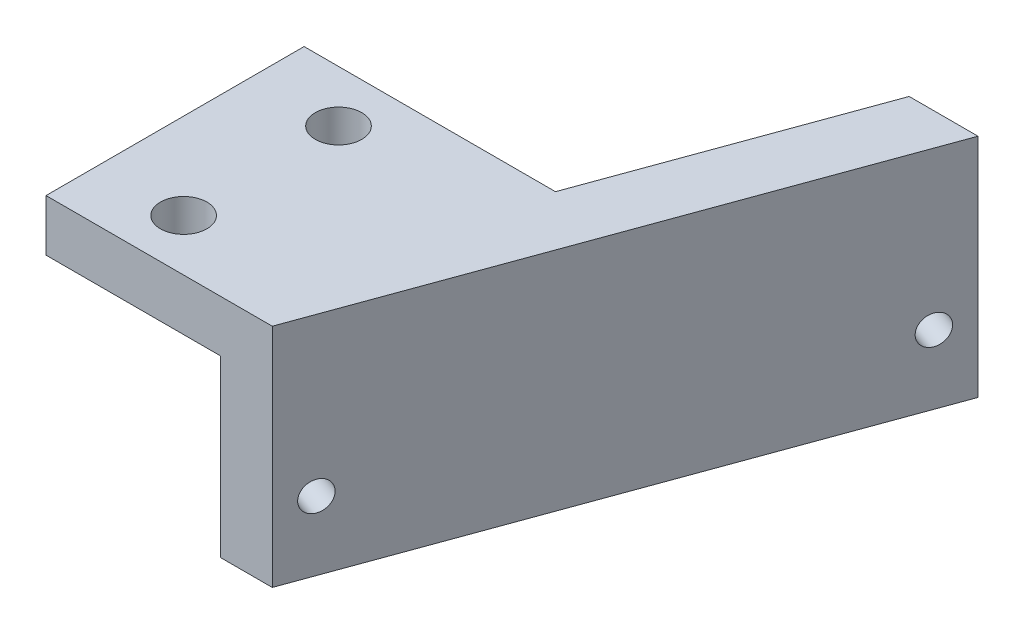
ISO-10303-21;
HEADER;
FILE_DESCRIPTION(('STEP AP214'),'2;1');
FILE_NAME('part.step','',(''),(''),'','','');
FILE_SCHEMA(('AUTOMOTIVE_DESIGN { 1 0 10303 214 1 1 1 1 }'));
ENDSEC;
DATA;
#1=APPLICATION_CONTEXT('core data for automotive mechanical design processes');
#2=APPLICATION_PROTOCOL_DEFINITION('international standard','automotive_design',2000,#1);
#3=PRODUCT_CONTEXT('',#1,'mechanical');
#4=PRODUCT('Part','Part','',(#3));
#5=PRODUCT_RELATED_PRODUCT_CATEGORY('part','',(#4));
#6=PRODUCT_DEFINITION_FORMATION('','',#4);
#7=PRODUCT_DEFINITION_CONTEXT('part definition',#1,'design');
#8=PRODUCT_DEFINITION('design','',#6,#7);
#9=PRODUCT_DEFINITION_SHAPE('','',#8);
#10=(LENGTH_UNIT() NAMED_UNIT(*) SI_UNIT(.MILLI.,.METRE.));
#11=(NAMED_UNIT(*) PLANE_ANGLE_UNIT() SI_UNIT($,.RADIAN.));
#12=(NAMED_UNIT(*) SI_UNIT($,.STERADIAN.) SOLID_ANGLE_UNIT());
#13=UNCERTAINTY_MEASURE_WITH_UNIT(LENGTH_MEASURE(1.E-05),#10,'distance_accuracy_value','');
#14=(GEOMETRIC_REPRESENTATION_CONTEXT(3) GLOBAL_UNCERTAINTY_ASSIGNED_CONTEXT((#13)) GLOBAL_UNIT_ASSIGNED_CONTEXT((#10,
#11,#12)) REPRESENTATION_CONTEXT('',''));
#15=CARTESIAN_POINT('',(0.,0.,0.));
#16=DIRECTION('',(0.,0.,1.));
#17=DIRECTION('',(1.,0.,0.));
#18=AXIS2_PLACEMENT_3D('',#15,#16,#17);
#19=CARTESIAN_POINT('',(6.,0.,30.));
#20=DIRECTION('',(0.,1.,0.));
#21=DIRECTION('',(-1.,0.,0.));
#22=AXIS2_PLACEMENT_3D('',#19,#20,#21);
#23=PLANE('',#22);
#24=DIRECTION('',(1.,0.,0.));
#25=VECTOR('',#24,1.);
#26=CARTESIAN_POINT('',(6.,0.,0.));
#27=LINE('',#26,#25);
#28=CARTESIAN_POINT('',(0.,0.,0.));
#29=VERTEX_POINT('',#28);
#30=CARTESIAN_POINT('',(8.91910702798621,0.,0.));
#31=VERTEX_POINT('',#30);
#32=EDGE_CURVE('E158',#29,#31,#27,.T.);
#33=ORIENTED_EDGE('',*,*,#32,.T.);
#34=DIRECTION('',(0.342020143325672,0.,-0.939692620785907));
#35=VECTOR('',#34,1.);
#36=CARTESIAN_POINT('',(19.889289172843,0.,-30.1403277302981));
#37=LINE('',#36,#35);
#38=CARTESIAN_POINT('',(19.889289172843,0.,-30.1403277302981));
#39=VERTEX_POINT('',#38);
#40=EDGE_CURVE('E163',#31,#39,#37,.T.);
#41=ORIENTED_EDGE('',*,*,#40,.T.);
#42=DIRECTION('',(1.,0.,0.));
#43=VECTOR('',#42,1.);
#44=CARTESIAN_POINT('',(27.889289172843,0.,-30.1403277302981));
#45=LINE('',#44,#43);
#46=CARTESIAN_POINT('',(27.889289172843,0.,-30.1403277302981));
#47=VERTEX_POINT('',#46);
#48=EDGE_CURVE('E139',#39,#47,#45,.T.);
#49=ORIENTED_EDGE('',*,*,#48,.T.);
#50=DIRECTION('',(-0.342020143325673,0.,0.939692620785907));
#51=VECTOR('',#50,1.);
#52=CARTESIAN_POINT('',(16.9191070279862,0.,0.));
#53=LINE('',#52,#51);
#54=CARTESIAN_POINT('',(6.,0.,30.));
#55=VERTEX_POINT('',#54);
#56=EDGE_CURVE('E159',#47,#55,#53,.T.);
#57=ORIENTED_EDGE('',*,*,#56,.T.);
#58=DIRECTION('',(1.,0.,0.));
#59=VECTOR('',#58,1.);
#60=CARTESIAN_POINT('',(6.,0.,30.));
#61=LINE('',#60,#59);
#62=CARTESIAN_POINT('',(0.,0.,30.));
#63=VERTEX_POINT('',#62);
#64=EDGE_CURVE('E164',#63,#55,#61,.T.);
#65=ORIENTED_EDGE('',*,*,#64,.F.);
#66=DIRECTION('',(0.,0.,-1.));
#67=VECTOR('',#66,1.);
#68=CARTESIAN_POINT('',(0.,0.,30.));
#69=LINE('',#68,#67);
#70=EDGE_CURVE('E183',#63,#29,#69,.T.);
#71=ORIENTED_EDGE('',*,*,#70,.T.);
#72=EDGE_LOOP('',(#33,#41,#49,#57,#65,#71));
#73=FACE_BOUND('',#72,.T.);
#74=ADVANCED_FACE('F39',(#73),#23,.F.);
#75=CARTESIAN_POINT('',(-20.3,26.3,30.));
#76=DIRECTION('',(0.,-1.,0.));
#77=DIRECTION('',(1.,0.,0.));
#78=AXIS2_PLACEMENT_3D('',#75,#76,#77);
#79=PLANE('',#78);
#80=CARTESIAN_POINT('',(-10.3,26.3,24.));
#81=DIRECTION('',(0.,1.,0.));
#82=DIRECTION('',(-1.,0.,0.));
#83=AXIS2_PLACEMENT_3D('',#80,#81,#82);
#84=CIRCLE('',#83,2.7);
#85=CARTESIAN_POINT('',(-13.,26.3,24.));
#86=VERTEX_POINT('',#85);
#87=EDGE_CURVE('E227',#86,#86,#84,.T.);
#88=ORIENTED_EDGE('',*,*,#87,.F.);
#89=EDGE_LOOP('',(#88));
#90=FACE_BOUND('',#89,.T.);
#91=CARTESIAN_POINT('',(-10.3,26.3,6.));
#92=DIRECTION('',(0.,1.,0.));
#93=DIRECTION('',(-1.,0.,0.));
#94=AXIS2_PLACEMENT_3D('',#91,#92,#93);
#95=CIRCLE('',#94,2.7);
#96=CARTESIAN_POINT('',(-13.,26.3,6.));
#97=VERTEX_POINT('',#96);
#98=EDGE_CURVE('E234',#97,#97,#95,.T.);
#99=ORIENTED_EDGE('',*,*,#98,.F.);
#100=EDGE_LOOP('',(#99));
#101=FACE_BOUND('',#100,.T.);
#102=DIRECTION('',(0.342020143325673,0.,-0.939692620785907));
#103=VECTOR('',#102,1.);
#104=CARTESIAN_POINT('',(16.9191070279862,26.3,0.));
#105=LINE('',#104,#103);
#106=CARTESIAN_POINT('',(6.,26.3,30.));
#107=VERTEX_POINT('',#106);
#108=CARTESIAN_POINT('',(27.889289172843,26.3,-30.1403277302981));
#109=VERTEX_POINT('',#108);
#110=EDGE_CURVE('E155',#107,#109,#105,.T.);
#111=ORIENTED_EDGE('',*,*,#110,.T.);
#112=DIRECTION('',(-1.,0.,0.));
#113=VECTOR('',#112,1.);
#114=CARTESIAN_POINT('',(27.889289172843,26.3,-30.1403277302981));
#115=LINE('',#114,#113);
#116=CARTESIAN_POINT('',(19.889289172843,26.3,-30.1403277302981));
#117=VERTEX_POINT('',#116);
#118=EDGE_CURVE('E251',#109,#117,#115,.T.);
#119=ORIENTED_EDGE('',*,*,#118,.T.);
#120=DIRECTION('',(-0.342020143325673,0.,0.939692620785907));
#121=VECTOR('',#120,1.);
#122=CARTESIAN_POINT('',(19.889289172843,26.3,-30.1403277302981));
#123=LINE('',#122,#121);
#124=CARTESIAN_POINT('',(8.91910702798621,26.3,0.));
#125=VERTEX_POINT('',#124);
#126=EDGE_CURVE('E154',#117,#125,#123,.T.);
#127=ORIENTED_EDGE('',*,*,#126,.T.);
#128=DIRECTION('',(-1.,0.,0.));
#129=VECTOR('',#128,1.);
#130=CARTESIAN_POINT('',(-20.3,26.3,0.));
#131=LINE('',#130,#129);
#132=CARTESIAN_POINT('',(-20.3,26.3,0.));
#133=VERTEX_POINT('',#132);
#134=EDGE_CURVE('E186',#125,#133,#131,.T.);
#135=ORIENTED_EDGE('',*,*,#134,.T.);
#136=DIRECTION('',(0.,0.,-1.));
#137=VECTOR('',#136,1.);
#138=CARTESIAN_POINT('',(-20.3,26.3,30.));
#139=LINE('',#138,#137);
#140=CARTESIAN_POINT('',(-20.3,26.3,30.));
#141=VERTEX_POINT('',#140);
#142=EDGE_CURVE('E208',#141,#133,#139,.T.);
#143=ORIENTED_EDGE('',*,*,#142,.F.);
#144=DIRECTION('',(-1.,0.,0.));
#145=VECTOR('',#144,1.);
#146=CARTESIAN_POINT('',(-20.3,26.3,30.));
#147=LINE('',#146,#145);
#148=EDGE_CURVE('E171',#107,#141,#147,.T.);
#149=ORIENTED_EDGE('',*,*,#148,.F.);
#150=EDGE_LOOP('',(#111,#119,#127,#135,#143,#149));
#151=FACE_BOUND('',#150,.T.);
#152=ADVANCED_FACE('F265',(#90,#101,#151),#79,.F.);
#153=CARTESIAN_POINT('',(-20.3,20.3,30.));
#154=DIRECTION('',(1.,0.,0.));
#155=DIRECTION('',(0.,1.,0.));
#156=AXIS2_PLACEMENT_3D('',#153,#154,#155);
#157=PLANE('',#156);
#158=DIRECTION('',(0.,-1.,0.));
#159=VECTOR('',#158,1.);
#160=CARTESIAN_POINT('',(-20.3,20.3,0.));
#161=LINE('',#160,#159);
#162=CARTESIAN_POINT('',(-20.3,20.3,0.));
#163=VERTEX_POINT('',#162);
#164=EDGE_CURVE('E189',#133,#163,#161,.T.);
#165=ORIENTED_EDGE('',*,*,#164,.T.);
#166=DIRECTION('',(0.,0.,-1.));
#167=VECTOR('',#166,1.);
#168=CARTESIAN_POINT('',(-20.3,20.3,30.));
#169=LINE('',#168,#167);
#170=CARTESIAN_POINT('',(-20.3,20.3,30.));
#171=VERTEX_POINT('',#170);
#172=EDGE_CURVE('E204',#171,#163,#169,.T.);
#173=ORIENTED_EDGE('',*,*,#172,.F.);
#174=DIRECTION('',(0.,-1.,0.));
#175=VECTOR('',#174,1.);
#176=CARTESIAN_POINT('',(-20.3,20.3,30.));
#177=LINE('',#176,#175);
#178=EDGE_CURVE('E174',#141,#171,#177,.T.);
#179=ORIENTED_EDGE('',*,*,#178,.F.);
#180=ORIENTED_EDGE('',*,*,#142,.T.);
#181=EDGE_LOOP('',(#165,#173,#179,#180));
#182=FACE_BOUND('',#181,.T.);
#183=ADVANCED_FACE('F287',(#182),#157,.F.);
#184=CARTESIAN_POINT('',(0.,20.3,30.));
#185=DIRECTION('',(0.,1.,0.));
#186=DIRECTION('',(-1.,0.,0.));
#187=AXIS2_PLACEMENT_3D('',#184,#185,#186);
#188=PLANE('',#187);
#189=CARTESIAN_POINT('',(-10.3,20.3,24.));
#190=DIRECTION('',(0.,1.,0.));
#191=DIRECTION('',(-1.,0.,0.));
#192=AXIS2_PLACEMENT_3D('',#189,#190,#191);
#193=CIRCLE('',#192,2.7);
#194=CARTESIAN_POINT('',(-13.,20.3,24.));
#195=VERTEX_POINT('',#194);
#196=EDGE_CURVE('E42',#195,#195,#193,.T.);
#197=ORIENTED_EDGE('',*,*,#196,.T.);
#198=EDGE_LOOP('',(#197));
#199=FACE_BOUND('',#198,.T.);
#200=CARTESIAN_POINT('',(-10.3,20.3,6.));
#201=DIRECTION('',(0.,1.,0.));
#202=DIRECTION('',(-1.,0.,0.));
#203=AXIS2_PLACEMENT_3D('',#200,#201,#202);
#204=CIRCLE('',#203,2.7);
#205=CARTESIAN_POINT('',(-13.,20.3,6.));
#206=VERTEX_POINT('',#205);
#207=EDGE_CURVE('E224',#206,#206,#204,.T.);
#208=ORIENTED_EDGE('',*,*,#207,.T.);
#209=EDGE_LOOP('',(#208));
#210=FACE_BOUND('',#209,.T.);
#211=DIRECTION('',(1.,0.,0.));
#212=VECTOR('',#211,1.);
#213=CARTESIAN_POINT('',(0.,20.3,0.));
#214=LINE('',#213,#212);
#215=CARTESIAN_POINT('',(0.,20.3,0.));
#216=VERTEX_POINT('',#215);
#217=EDGE_CURVE('E192',#163,#216,#214,.T.);
#218=ORIENTED_EDGE('',*,*,#217,.T.);
#219=DIRECTION('',(0.,0.,-1.));
#220=VECTOR('',#219,1.);
#221=CARTESIAN_POINT('',(0.,20.3,30.));
#222=LINE('',#221,#220);
#223=CARTESIAN_POINT('',(0.,20.3,30.));
#224=VERTEX_POINT('',#223);
#225=EDGE_CURVE('E200',#224,#216,#222,.T.);
#226=ORIENTED_EDGE('',*,*,#225,.F.);
#227=DIRECTION('',(1.,0.,0.));
#228=VECTOR('',#227,1.);
#229=CARTESIAN_POINT('',(0.,20.3,30.));
#230=LINE('',#229,#228);
#231=EDGE_CURVE('E177',#171,#224,#230,.T.);
#232=ORIENTED_EDGE('',*,*,#231,.F.);
#233=ORIENTED_EDGE('',*,*,#172,.T.);
#234=EDGE_LOOP('',(#218,#226,#232,#233));
#235=FACE_BOUND('',#234,.T.);
#236=ADVANCED_FACE('F283',(#199,#210,#235),#188,.F.);
#237=CARTESIAN_POINT('',(0.,0.,30.));
#238=DIRECTION('',(1.,0.,0.));
#239=DIRECTION('',(0.,0.,-1.));
#240=AXIS2_PLACEMENT_3D('',#237,#238,#239);
#241=PLANE('',#240);
#242=CARTESIAN_POINT('',(0.,7.99999999999998,23.5594675044991));
#243=DIRECTION('',(1.,0.,0.));
#244=DIRECTION('',(0.,0.,1.));
#245=AXIS2_PLACEMENT_3D('',#242,#243,#244);
#246=ELLIPSE('',#245,3.13932442880395,2.95);
#247=CARTESIAN_POINT('',(0.,7.99999999999998,26.6987919333031));
#248=VERTEX_POINT('',#247);
#249=EDGE_CURVE('E220',#248,#248,#246,.T.);
#250=ORIENTED_EDGE('',*,*,#249,.T.);
#251=EDGE_LOOP('',(#250));
#252=FACE_BOUND('',#251,.T.);
#253=DIRECTION('',(0.,-1.,0.));
#254=VECTOR('',#253,1.);
#255=CARTESIAN_POINT('',(0.,0.,0.));
#256=LINE('',#255,#254);
#257=EDGE_CURVE('E168',#216,#29,#256,.T.);
#258=ORIENTED_EDGE('',*,*,#257,.T.);
#259=ORIENTED_EDGE('',*,*,#70,.F.);
#260=DIRECTION('',(0.,-1.,0.));
#261=VECTOR('',#260,1.);
#262=CARTESIAN_POINT('',(0.,0.,30.));
#263=LINE('',#262,#261);
#264=EDGE_CURVE('E180',#224,#63,#263,.T.);
#265=ORIENTED_EDGE('',*,*,#264,.F.);
#266=ORIENTED_EDGE('',*,*,#225,.T.);
#267=EDGE_LOOP('',(#258,#259,#265,#266));
#268=FACE_BOUND('',#267,.T.);
#269=ADVANCED_FACE('F278',(#252,#268),#241,.F.);
#270=CARTESIAN_POINT('',(0.,0.,30.));
#271=DIRECTION('',(0.,0.,-1.));
#272=DIRECTION('',(-1.,0.,0.));
#273=AXIS2_PLACEMENT_3D('',#270,#271,#272);
#274=PLANE('',#273);
#275=ORIENTED_EDGE('',*,*,#64,.T.);
#276=DIRECTION('',(0.,1.,0.));
#277=VECTOR('',#276,1.);
#278=CARTESIAN_POINT('',(6.,26.3,30.));
#279=LINE('',#278,#277);
#280=EDGE_CURVE('E167',#55,#107,#279,.T.);
#281=ORIENTED_EDGE('',*,*,#280,.T.);
#282=ORIENTED_EDGE('',*,*,#148,.T.);
#283=ORIENTED_EDGE('',*,*,#178,.T.);
#284=ORIENTED_EDGE('',*,*,#231,.T.);
#285=ORIENTED_EDGE('',*,*,#264,.T.);
#286=EDGE_LOOP('',(#275,#281,#282,#283,#284,#285));
#287=FACE_BOUND('',#286,.T.);
#288=ADVANCED_FACE('F294',(#287),#274,.F.);
#289=CARTESIAN_POINT('',(0.,0.,0.));
#290=DIRECTION('',(0.,0.,-1.));
#291=DIRECTION('',(-1.,0.,0.));
#292=AXIS2_PLACEMENT_3D('',#289,#290,#291);
#293=PLANE('',#292);
#294=DIRECTION('',(0.,1.,0.));
#295=VECTOR('',#294,1.);
#296=CARTESIAN_POINT('',(8.9191070279862,-35.613300412891,0.));
#297=LINE('',#296,#295);
#298=EDGE_CURVE('E63',#31,#125,#297,.T.);
#299=ORIENTED_EDGE('',*,*,#298,.F.);
#300=ORIENTED_EDGE('',*,*,#32,.F.);
#301=ORIENTED_EDGE('',*,*,#257,.F.);
#302=ORIENTED_EDGE('',*,*,#217,.F.);
#303=ORIENTED_EDGE('',*,*,#164,.F.);
#304=ORIENTED_EDGE('',*,*,#134,.F.);
#305=EDGE_LOOP('',(#299,#300,#301,#302,#303,#304));
#306=FACE_BOUND('',#305,.T.);
#307=ADVANCED_FACE('F274',(#306),#293,.T.);
#308=CARTESIAN_POINT('',(16.9191070279862,58.2253331742774,0.));
#309=DIRECTION('',(0.939692620785907,0.,0.342020143325673));
#310=DIRECTION('',(0.342020143325673,0.,-0.939692620785907));
#311=AXIS2_PLACEMENT_3D('',#308,#309,#310);
#312=PLANE('',#311);
#313=CARTESIAN_POINT('',(7.3680805733027,7.99999999999998,26.2412295168564));
#314=DIRECTION('',(0.939692620785907,0.,0.342020143325673));
#315=DIRECTION('',(0.342020143325673,0.,-0.939692620785907));
#316=AXIS2_PLACEMENT_3D('',#313,#314,#315);
#317=CIRCLE('',#316,1.7);
#318=CARTESIAN_POINT('',(7.94951481695634,7.99999999999998,24.6437520615203));
#319=VERTEX_POINT('',#318);
#320=EDGE_CURVE('E247',#319,#319,#317,.T.);
#321=ORIENTED_EDGE('',*,*,#320,.F.);
#322=EDGE_LOOP('',(#321));
#323=FACE_BOUND('',#322,.T.);
#324=CARTESIAN_POINT('',(26.5212085995404,7.99999999999998,-26.3815572471544));
#325=DIRECTION('',(0.939692620785907,0.,0.342020143325673));
#326=DIRECTION('',(-0.342020143325673,0.,0.939692620785907));
#327=AXIS2_PLACEMENT_3D('',#324,#325,#326);
#328=CIRCLE('',#327,1.7);
#329=CARTESIAN_POINT('',(25.9397743558867,7.99999999999998,-24.7840797918184));
#330=VERTEX_POINT('',#329);
#331=EDGE_CURVE('E223',#330,#330,#328,.T.);
#332=ORIENTED_EDGE('',*,*,#331,.F.);
#333=EDGE_LOOP('',(#332));
#334=FACE_BOUND('',#333,.T.);
#335=ORIENTED_EDGE('',*,*,#110,.F.);
#336=ORIENTED_EDGE('',*,*,#280,.F.);
#337=ORIENTED_EDGE('',*,*,#56,.F.);
#338=DIRECTION('',(0.,1.,0.));
#339=VECTOR('',#338,1.);
#340=CARTESIAN_POINT('',(27.889289172843,-35.613300412891,-30.1403277302981));
#341=LINE('',#340,#339);
#342=EDGE_CURVE('E148',#47,#109,#341,.T.);
#343=ORIENTED_EDGE('',*,*,#342,.T.);
#344=EDGE_LOOP('',(#335,#336,#337,#343));
#345=FACE_BOUND('',#344,.T.);
#346=ADVANCED_FACE('F293',(#323,#334,#345),#312,.T.);
#347=CARTESIAN_POINT('',(19.889289172843,-35.613300412891,-30.1403277302981));
#348=DIRECTION('',(-0.939692620785907,0.,-0.342020143325672));
#349=DIRECTION('',(-0.342020143325672,0.,0.939692620785907));
#350=AXIS2_PLACEMENT_3D('',#347,#348,#349);
#351=PLANE('',#350);
#352=CARTESIAN_POINT('',(19.4570308270645,7.99999999999998,-28.9527076859006));
#353=DIRECTION('',(-0.939692620785907,0.,-0.342020143325672));
#354=DIRECTION('',(-0.342020143325672,0.,0.939692620785907));
#355=AXIS2_PLACEMENT_3D('',#352,#353,#354);
#356=CIRCLE('',#355,2.95);
#357=CARTESIAN_POINT('',(19.889289172843,5.33443976758162,-30.1403277302981));
#358=VERTEX_POINT('',#357);
#359=CARTESIAN_POINT('',(19.889289172843,10.6655602324183,-30.1403277302981));
#360=VERTEX_POINT('',#359);
#361=EDGE_CURVE('E123',#358,#360,#356,.T.);
#362=ORIENTED_EDGE('',*,*,#361,.F.);
#363=DIRECTION('',(0.,1.,0.));
#364=VECTOR('',#363,1.);
#365=CARTESIAN_POINT('',(19.889289172843,-35.613300412891,-30.1403277302981));
#366=LINE('',#365,#364);
#367=EDGE_CURVE('E136',#39,#358,#366,.T.);
#368=ORIENTED_EDGE('',*,*,#367,.F.);
#369=ORIENTED_EDGE('',*,*,#40,.F.);
#370=ORIENTED_EDGE('',*,*,#298,.T.);
#371=ORIENTED_EDGE('',*,*,#126,.F.);
#372=EDGE_CURVE('E143',#360,#117,#366,.T.);
#373=ORIENTED_EDGE('',*,*,#372,.F.);
#374=EDGE_LOOP('',(#362,#368,#369,#370,#371,#373));
#375=FACE_BOUND('',#374,.T.);
#376=ADVANCED_FACE('F269',(#375),#351,.T.);
#377=CARTESIAN_POINT('',(27.889289172843,-35.613300412891,-30.1403277302981));
#378=DIRECTION('',(0.,0.,-1.));
#379=DIRECTION('',(-1.,0.,0.));
#380=AXIS2_PLACEMENT_3D('',#377,#378,#379);
#381=PLANE('',#380);
#382=CARTESIAN_POINT('',(16.1940715721908,7.99999999999998,-30.1403277302981));
#383=DIRECTION('',(0.,0.,-1.));
#384=DIRECTION('',(1.,0.,0.));
#385=AXIS2_PLACEMENT_3D('',#382,#383,#384);
#386=ELLIPSE('',#385,8.62522298048102,2.95);
#387=CARTESIAN_POINT('',(21.5042225379876,5.67535049669131,-30.1403277302981));
#388=VERTEX_POINT('',#387);
#389=EDGE_CURVE('E11',#388,#358,#386,.T.);
#390=ORIENTED_EDGE('',*,*,#389,.F.);
#391=DIRECTION('',(0.,-1.,0.));
#392=VECTOR('',#391,1.);
#393=CARTESIAN_POINT('',(21.5042225379876,-35.613300412891,-30.1403277302981));
#394=LINE('',#393,#392);
#395=CARTESIAN_POINT('',(21.5042225379876,10.3246495033087,-30.1403277302981));
#396=VERTEX_POINT('',#395);
#397=EDGE_CURVE('E116',#396,#388,#394,.T.);
#398=ORIENTED_EDGE('',*,*,#397,.F.);
#399=EDGE_CURVE('E48',#360,#396,#386,.T.);
#400=ORIENTED_EDGE('',*,*,#399,.F.);
#401=ORIENTED_EDGE('',*,*,#372,.T.);
#402=ORIENTED_EDGE('',*,*,#118,.F.);
#403=ORIENTED_EDGE('',*,*,#342,.F.);
#404=ORIENTED_EDGE('',*,*,#48,.F.);
#405=ORIENTED_EDGE('',*,*,#367,.T.);
#406=EDGE_LOOP('',(#390,#398,#400,#401,#402,#403,#404,#405));
#407=FACE_BOUND('',#406,.T.);
#408=ADVANCED_FACE('F133',(#407),#381,.T.);
#409=CARTESIAN_POINT('',(-4.66333733895575,7.99999999999998,-37.7318037378742));
#410=DIRECTION('',(0.939692620785907,0.,0.342020143325673));
#411=DIRECTION('',(0.342020143325673,0.,-0.939692620785907));
#412=AXIS2_PLACEMENT_3D('',#409,#410,#411);
#413=CYLINDRICAL_SURFACE('',#412,1.7);
#414=CARTESIAN_POINT('',(20.8830528748249,7.99999999999998,-28.4336781071085));
#415=DIRECTION('',(0.939692620785907,0.,0.342020143325673));
#416=DIRECTION('',(0.342020143325673,0.,-0.939692620785907));
#417=AXIS2_PLACEMENT_3D('',#414,#415,#416);
#418=CIRCLE('',#417,1.7);
#419=CARTESIAN_POINT('',(21.4644871184786,7.99999999999998,-30.0311555624445));
#420=VERTEX_POINT('',#419);
#421=EDGE_CURVE('E124',#420,#420,#418,.F.);
#422=ORIENTED_EDGE('',*,*,#421,.T.);
#423=EDGE_LOOP('',(#422));
#424=FACE_BOUND('',#423,.T.);
#425=ORIENTED_EDGE('',*,*,#331,.T.);
#426=EDGE_LOOP('',(#425));
#427=FACE_BOUND('',#426,.T.);
#428=ADVANCED_FACE('F347',(#424,#427),#413,.F.);
#429=CARTESIAN_POINT('',(-23.8164653651934,7.99999999999998,14.8909830261366));
#430=DIRECTION('',(0.939692620785907,0.,0.342020143325673));
#431=DIRECTION('',(0.342020143325673,0.,-0.939692620785907));
#432=AXIS2_PLACEMENT_3D('',#429,#430,#431);
#433=CYLINDRICAL_SURFACE('',#432,1.7);
#434=CARTESIAN_POINT('',(1.72992484858725,7.99999999999998,24.1891086569023));
#435=DIRECTION('',(0.939692620785907,0.,0.342020143325673));
#436=DIRECTION('',(0.342020143325673,0.,-0.939692620785907));
#437=AXIS2_PLACEMENT_3D('',#434,#435,#436);
#438=CIRCLE('',#437,1.7);
#439=CARTESIAN_POINT('',(2.3113590922409,7.99999999999998,22.5916312015663));
#440=VERTEX_POINT('',#439);
#441=EDGE_CURVE('E212',#440,#440,#438,.F.);
#442=ORIENTED_EDGE('',*,*,#441,.T.);
#443=EDGE_LOOP('',(#442));
#444=FACE_BOUND('',#443,.T.);
#445=ORIENTED_EDGE('',*,*,#320,.T.);
#446=EDGE_LOOP('',(#445));
#447=FACE_BOUND('',#446,.T.);
#448=ADVANCED_FACE('F339',(#444,#447),#433,.F.);
#449=CARTESIAN_POINT('',(-18.0036201879168,7.99999999999998,17.0066856470632));
#450=DIRECTION('',(0.939692620785907,0.,0.342020143325673));
#451=DIRECTION('',(0.342020143325673,0.,-0.939692620785907));
#452=AXIS2_PLACEMENT_3D('',#449,#450,#451);
#453=CYLINDRICAL_SURFACE('',#452,2.95);
#454=CARTESIAN_POINT('',(1.72992484858725,7.99999999999998,24.1891086569023));
#455=DIRECTION('',(0.939692620785907,0.,0.342020143325673));
#456=DIRECTION('',(0.342020143325673,0.,-0.939692620785907));
#457=AXIS2_PLACEMENT_3D('',#454,#455,#456);
#458=CIRCLE('',#457,2.95);
#459=CARTESIAN_POINT('',(2.73888427139799,7.99999999999998,21.4170154255839));
#460=VERTEX_POINT('',#459);
#461=EDGE_CURVE('E130',#460,#460,#458,.T.);
#462=ORIENTED_EDGE('',*,*,#461,.T.);
#463=EDGE_LOOP('',(#462));
#464=FACE_BOUND('',#463,.T.);
#465=ORIENTED_EDGE('',*,*,#249,.F.);
#466=EDGE_LOOP('',(#465));
#467=FACE_BOUND('',#466,.T.);
#468=ADVANCED_FACE('F335',(#464,#467),#453,.F.);
#469=CARTESIAN_POINT('',(1.72992484858725,7.99999999999998,24.1891086569023));
#470=DIRECTION('',(0.939692620785907,0.,0.342020143325673));
#471=DIRECTION('',(0.342020143325673,0.,-0.939692620785907));
#472=AXIS2_PLACEMENT_3D('',#469,#470,#471);
#473=PLANE('',#472);
#474=ORIENTED_EDGE('',*,*,#461,.F.);
#475=EDGE_LOOP('',(#474));
#476=FACE_BOUND('',#475,.T.);
#477=ORIENTED_EDGE('',*,*,#441,.F.);
#478=EDGE_LOOP('',(#477));
#479=FACE_BOUND('',#478,.T.);
#480=ADVANCED_FACE('F332',(#476,#479),#473,.F.);
#481=CARTESIAN_POINT('',(20.8830528748249,7.99999999999998,-28.4336781071085));
#482=DIRECTION('',(0.939692620785907,0.,0.342020143325673));
#483=DIRECTION('',(0.342020143325673,0.,-0.939692620785907));
#484=AXIS2_PLACEMENT_3D('',#481,#482,#483);
#485=PLANE('',#484);
#486=ORIENTED_EDGE('',*,*,#397,.T.);
#487=CARTESIAN_POINT('',(20.8830528748249,7.99999999999998,-28.4336781071085));
#488=DIRECTION('',(0.939692620785907,0.,0.342020143325673));
#489=DIRECTION('',(0.342020143325673,0.,-0.939692620785907));
#490=AXIS2_PLACEMENT_3D('',#487,#488,#489);
#491=CIRCLE('',#490,2.95);
#492=EDGE_CURVE('E55',#396,#388,#491,.T.);
#493=ORIENTED_EDGE('',*,*,#492,.F.);
#494=EDGE_LOOP('',(#486,#493));
#495=FACE_BOUND('',#494,.T.);
#496=ORIENTED_EDGE('',*,*,#421,.F.);
#497=EDGE_LOOP('',(#496));
#498=FACE_BOUND('',#497,.T.);
#499=ADVANCED_FACE('F117',(#495,#498),#485,.F.);
#500=CARTESIAN_POINT('',(1.14950783832088,7.99999999999998,-35.6161011169476));
#501=DIRECTION('',(0.939692620785907,0.,0.342020143325673));
#502=DIRECTION('',(0.342020143325673,0.,-0.939692620785907));
#503=AXIS2_PLACEMENT_3D('',#500,#501,#502);
#504=CYLINDRICAL_SURFACE('',#503,2.95);
#505=ORIENTED_EDGE('',*,*,#389,.T.);
#506=ORIENTED_EDGE('',*,*,#361,.T.);
#507=ORIENTED_EDGE('',*,*,#399,.T.);
#508=ORIENTED_EDGE('',*,*,#492,.T.);
#509=EDGE_LOOP('',(#505,#506,#507,#508));
#510=FACE_BOUND('',#509,.T.);
#511=ADVANCED_FACE('F127',(#510),#504,.F.);
#512=CARTESIAN_POINT('',(-10.3,5.3,6.));
#513=DIRECTION('',(0.,1.,0.));
#514=DIRECTION('',(-1.,0.,0.));
#515=AXIS2_PLACEMENT_3D('',#512,#513,#514);
#516=CYLINDRICAL_SURFACE('',#515,2.7);
#517=ORIENTED_EDGE('',*,*,#98,.T.);
#518=EDGE_LOOP('',(#517));
#519=FACE_BOUND('',#518,.T.);
#520=ORIENTED_EDGE('',*,*,#207,.F.);
#521=EDGE_LOOP('',(#520));
#522=FACE_BOUND('',#521,.T.);
#523=ADVANCED_FACE('F324',(#519,#522),#516,.F.);
#524=CARTESIAN_POINT('',(-10.3,5.3,24.));
#525=DIRECTION('',(0.,1.,0.));
#526=DIRECTION('',(-1.,0.,0.));
#527=AXIS2_PLACEMENT_3D('',#524,#525,#526);
#528=CYLINDRICAL_SURFACE('',#527,2.7);
#529=ORIENTED_EDGE('',*,*,#87,.T.);
#530=EDGE_LOOP('',(#529));
#531=FACE_BOUND('',#530,.T.);
#532=ORIENTED_EDGE('',*,*,#196,.F.);
#533=EDGE_LOOP('',(#532));
#534=FACE_BOUND('',#533,.T.);
#535=ADVANCED_FACE('F322',(#531,#534),#528,.F.);
#536=CLOSED_SHELL('',(#74,#152,#183,#236,#269,#288,#307,#346,#376,#408,#428,#448,#468,#480,#499,
#511,#523,#535));
#537=MANIFOLD_SOLID_BREP('B2',#536);
#538=ADVANCED_BREP_SHAPE_REPRESENTATION('',(#18,#537),#14);
#539=SHAPE_DEFINITION_REPRESENTATION(#9,#538);
ENDSEC;
END-ISO-10303-21;
